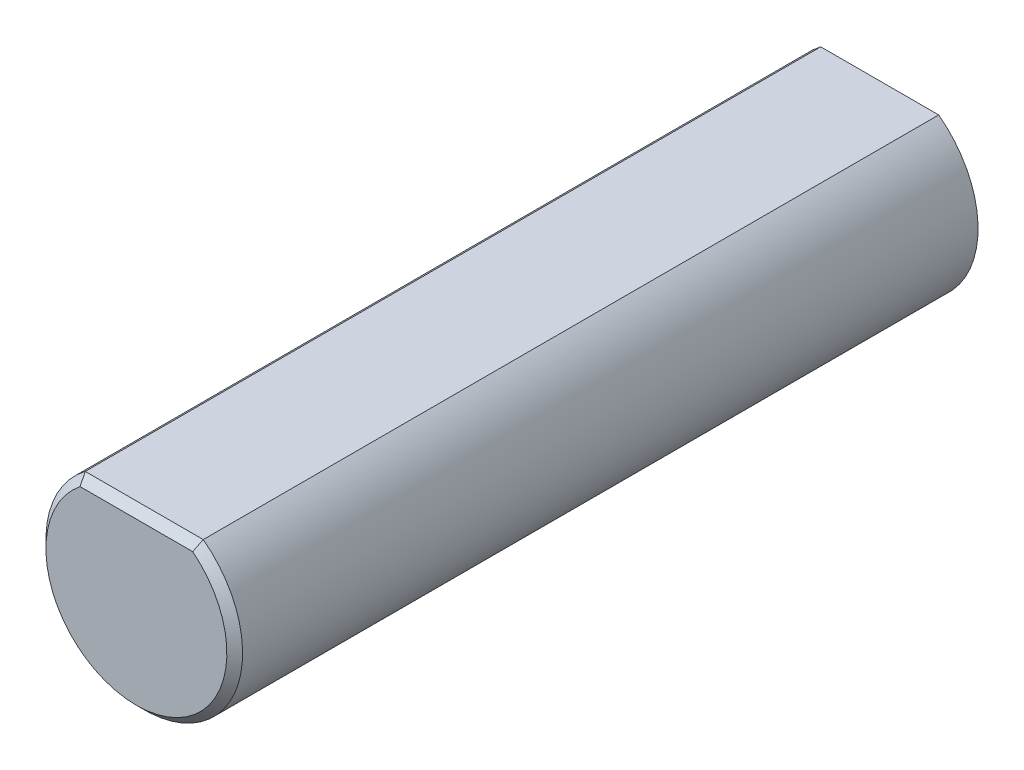
ISO-10303-21;
HEADER;
FILE_DESCRIPTION(('STEP AP214'),'2;1');
FILE_NAME('part.step','',(''),(''),'','','');
FILE_SCHEMA(('AUTOMOTIVE_DESIGN { 1 0 10303 214 1 1 1 1 }'));
ENDSEC;
DATA;
#1=APPLICATION_CONTEXT('core data for automotive mechanical design processes');
#2=APPLICATION_PROTOCOL_DEFINITION('international standard','automotive_design',2000,#1);
#3=PRODUCT_CONTEXT('',#1,'mechanical');
#4=PRODUCT('Part','Part','',(#3));
#5=PRODUCT_RELATED_PRODUCT_CATEGORY('part','',(#4));
#6=PRODUCT_DEFINITION_FORMATION('','',#4);
#7=PRODUCT_DEFINITION_CONTEXT('part definition',#1,'design');
#8=PRODUCT_DEFINITION('design','',#6,#7);
#9=PRODUCT_DEFINITION_SHAPE('','',#8);
#10=(LENGTH_UNIT() NAMED_UNIT(*) SI_UNIT(.MILLI.,.METRE.));
#11=(NAMED_UNIT(*) PLANE_ANGLE_UNIT() SI_UNIT($,.RADIAN.));
#12=(NAMED_UNIT(*) SI_UNIT($,.STERADIAN.) SOLID_ANGLE_UNIT());
#13=UNCERTAINTY_MEASURE_WITH_UNIT(LENGTH_MEASURE(1.E-05),#10,'distance_accuracy_value','');
#14=(GEOMETRIC_REPRESENTATION_CONTEXT(3) GLOBAL_UNCERTAINTY_ASSIGNED_CONTEXT((#13)) GLOBAL_UNIT_ASSIGNED_CONTEXT((#10,
#11,#12)) REPRESENTATION_CONTEXT('',''));
#15=CARTESIAN_POINT('',(0.,0.,0.));
#16=DIRECTION('',(0.,0.,1.));
#17=DIRECTION('',(1.,0.,0.));
#18=AXIS2_PLACEMENT_3D('',#15,#16,#17);
#19=CARTESIAN_POINT('',(0.,0.,12.));
#20=DIRECTION('',(0.,0.,-1.));
#21=DIRECTION('',(-1.,0.,0.));
#22=AXIS2_PLACEMENT_3D('',#19,#20,#21);
#23=CYLINDRICAL_SURFACE('',#22,3.175);
#24=DIRECTION('',(0.,0.,-1.));
#25=VECTOR('',#24,1.);
#26=CARTESIAN_POINT('',(1.905,2.54,12.));
#27=LINE('',#26,#25);
#28=CARTESIAN_POINT('',(1.905,2.54,11.746));
#29=VERTEX_POINT('',#28);
#30=CARTESIAN_POINT('',(1.905,2.54,-12.));
#31=VERTEX_POINT('',#30);
#32=EDGE_CURVE('E81',#29,#31,#27,.T.);
#33=ORIENTED_EDGE('',*,*,#32,.F.);
#34=CARTESIAN_POINT('',(0.,0.,11.746));
#35=DIRECTION('',(0.,0.,1.));
#36=DIRECTION('',(1.,0.,0.));
#37=AXIS2_PLACEMENT_3D('',#34,#35,#36);
#38=CIRCLE('',#37,3.175);
#39=CARTESIAN_POINT('',(-1.905,2.54,11.746));
#40=VERTEX_POINT('',#39);
#41=EDGE_CURVE('E11',#29,#40,#38,.F.);
#42=ORIENTED_EDGE('',*,*,#41,.T.);
#43=DIRECTION('',(0.,0.,-1.));
#44=VECTOR('',#43,1.);
#45=CARTESIAN_POINT('',(-1.905,2.54,12.));
#46=LINE('',#45,#44);
#47=CARTESIAN_POINT('',(-1.905,2.54,-12.));
#48=VERTEX_POINT('',#47);
#49=EDGE_CURVE('E89',#40,#48,#46,.T.);
#50=ORIENTED_EDGE('',*,*,#49,.T.);
#51=CARTESIAN_POINT('',(0.,0.,-12.));
#52=DIRECTION('',(0.,0.,1.));
#53=DIRECTION('',(1.,0.,0.));
#54=AXIS2_PLACEMENT_3D('',#51,#52,#53);
#55=CIRCLE('',#54,3.175);
#56=EDGE_CURVE('E93',#48,#31,#55,.T.);
#57=ORIENTED_EDGE('',*,*,#56,.T.);
#58=EDGE_LOOP('',(#33,#42,#50,#57));
#59=FACE_BOUND('',#58,.T.);
#60=ADVANCED_FACE('F39',(#59),#23,.T.);
#61=CARTESIAN_POINT('',(1.905,2.54,12.));
#62=DIRECTION('',(0.,-1.,0.));
#63=DIRECTION('',(0.,0.,-1.));
#64=AXIS2_PLACEMENT_3D('',#61,#62,#63);
#65=PLANE('',#64);
#66=ORIENTED_EDGE('',*,*,#49,.F.);
#67=DIRECTION('',(1.,0.,0.));
#68=VECTOR('',#67,1.);
#69=CARTESIAN_POINT('',(1.905,2.54,11.746));
#70=LINE('',#69,#68);
#71=EDGE_CURVE('E54',#40,#29,#70,.T.);
#72=ORIENTED_EDGE('',*,*,#71,.T.);
#73=ORIENTED_EDGE('',*,*,#32,.T.);
#74=DIRECTION('',(-1.,0.,0.));
#75=VECTOR('',#74,1.);
#76=CARTESIAN_POINT('',(1.905,2.54,-12.));
#77=LINE('',#76,#75);
#78=EDGE_CURVE('E84',#31,#48,#77,.T.);
#79=ORIENTED_EDGE('',*,*,#78,.T.);
#80=EDGE_LOOP('',(#66,#72,#73,#79));
#81=FACE_BOUND('',#80,.T.);
#82=ADVANCED_FACE('F83',(#81),#65,.F.);
#83=CARTESIAN_POINT('',(0.,0.,12.));
#84=DIRECTION('',(0.,0.,1.));
#85=DIRECTION('',(1.,0.,0.));
#86=AXIS2_PLACEMENT_3D('',#83,#84,#85);
#87=PLANE('',#86);
#88=CARTESIAN_POINT('',(0.,0.,12.));
#89=DIRECTION('',(0.,0.,1.));
#90=DIRECTION('',(1.,0.,0.));
#91=AXIS2_PLACEMENT_3D('',#88,#89,#90);
#92=CIRCLE('',#91,2.921);
#93=CARTESIAN_POINT('',(-1.81836327503614,2.28599999999996,12.));
#94=VERTEX_POINT('',#93);
#95=CARTESIAN_POINT('',(1.81836327503614,2.28599999999996,12.));
#96=VERTEX_POINT('',#95);
#97=EDGE_CURVE('E88',#94,#96,#92,.T.);
#98=ORIENTED_EDGE('',*,*,#97,.T.);
#99=DIRECTION('',(-1.,0.,0.));
#100=VECTOR('',#99,1.);
#101=CARTESIAN_POINT('',(-1.905,2.286,12.));
#102=LINE('',#101,#100);
#103=EDGE_CURVE('E105',#96,#94,#102,.T.);
#104=ORIENTED_EDGE('',*,*,#103,.T.);
#105=EDGE_LOOP('',(#98,#104));
#106=FACE_BOUND('',#105,.T.);
#107=ADVANCED_FACE('F125',(#106),#87,.T.);
#108=CARTESIAN_POINT('',(0.,0.,-12.));
#109=DIRECTION('',(0.,0.,1.));
#110=DIRECTION('',(1.,0.,0.));
#111=AXIS2_PLACEMENT_3D('',#108,#109,#110);
#112=PLANE('',#111);
#113=ORIENTED_EDGE('',*,*,#56,.F.);
#114=ORIENTED_EDGE('',*,*,#78,.F.);
#115=EDGE_LOOP('',(#113,#114));
#116=FACE_BOUND('',#115,.T.);
#117=ADVANCED_FACE('F92',(#116),#112,.F.);
#118=CARTESIAN_POINT('',(0.,0.,12.));
#119=DIRECTION('',(0.,0.,-1.));
#120=DIRECTION('',(-1.,0.,0.));
#121=AXIS2_PLACEMENT_3D('',#118,#119,#120);
#122=CONICAL_SURFACE('',#121,2.921,0.785398163397447);
#123=CARTESIAN_POINT('',(-1.81836327503617,2.286,12.));
#124=CARTESIAN_POINT('',(-1.8331202081611,2.32827920209275,11.9577207979072));
#125=CARTESIAN_POINT('',(-1.84771840387271,2.37058547601538,11.9154145239846));
#126=CARTESIAN_POINT('',(-1.87659731200799,2.45525214271377,11.8307478572862));
#127=CARTESIAN_POINT('',(-1.8908780246177,2.4976125354578,11.7883874645422));
#128=CARTESIAN_POINT('',(-1.90500000000012,2.53999999999998,11.746));
#129=B_SPLINE_CURVE_WITH_KNOTS('',3,(#123,#124,#125,#126,#127,#128),.UNSPECIFIED.,.F.,.F.,(4,2,
4),(0.,0.184755894358477,0.369511680453235),.UNSPECIFIED.);
#130=EDGE_CURVE('E99',#40,#94,#129,.F.);
#131=ORIENTED_EDGE('',*,*,#130,.F.);
#132=ORIENTED_EDGE('',*,*,#41,.F.);
#133=CARTESIAN_POINT('',(1.905,2.54,11.746));
#134=CARTESIAN_POINT('',(1.89087802461764,2.49761253545781,11.7883874645422));
#135=CARTESIAN_POINT('',(1.87659731200796,2.45525214271377,11.8307478572862));
#136=CARTESIAN_POINT('',(1.84771840387273,2.37058547601537,11.9154145239846));
#137=CARTESIAN_POINT('',(1.83312020816114,2.32827920209275,11.9577207979072));
#138=CARTESIAN_POINT('',(1.8183632750362,2.28599999999999,12.));
#139=B_SPLINE_CURVE_WITH_KNOTS('',3,(#133,#134,#135,#136,#137,#138),.UNSPECIFIED.,.F.,.F.,(4,2,
4),(0.,0.184755786094759,0.369511680453235),.UNSPECIFIED.);
#140=EDGE_CURVE('E44',#96,#29,#139,.F.);
#141=ORIENTED_EDGE('',*,*,#140,.F.);
#142=ORIENTED_EDGE('',*,*,#97,.F.);
#143=EDGE_LOOP('',(#131,#132,#141,#142));
#144=FACE_BOUND('',#143,.T.);
#145=ADVANCED_FACE('F115',(#144),#122,.T.);
#146=CARTESIAN_POINT('',(0.,2.286,12.));
#147=DIRECTION('',(0.,0.707106781186549,0.707106781186546));
#148=DIRECTION('',(1.,0.,0.));
#149=AXIS2_PLACEMENT_3D('',#146,#147,#148);
#150=PLANE('',#149);
#151=ORIENTED_EDGE('',*,*,#140,.T.);
#152=ORIENTED_EDGE('',*,*,#71,.F.);
#153=ORIENTED_EDGE('',*,*,#130,.T.);
#154=ORIENTED_EDGE('',*,*,#103,.F.);
#155=EDGE_LOOP('',(#151,#152,#153,#154));
#156=FACE_BOUND('',#155,.T.);
#157=ADVANCED_FACE('F41',(#156),#150,.T.);
#158=CLOSED_SHELL('',(#60,#82,#107,#117,#145,#157));
#159=MANIFOLD_SOLID_BREP('B2',#158);
#160=ADVANCED_BREP_SHAPE_REPRESENTATION('',(#18,#159),#14);
#161=SHAPE_DEFINITION_REPRESENTATION(#9,#160);
ENDSEC;
END-ISO-10303-21;
